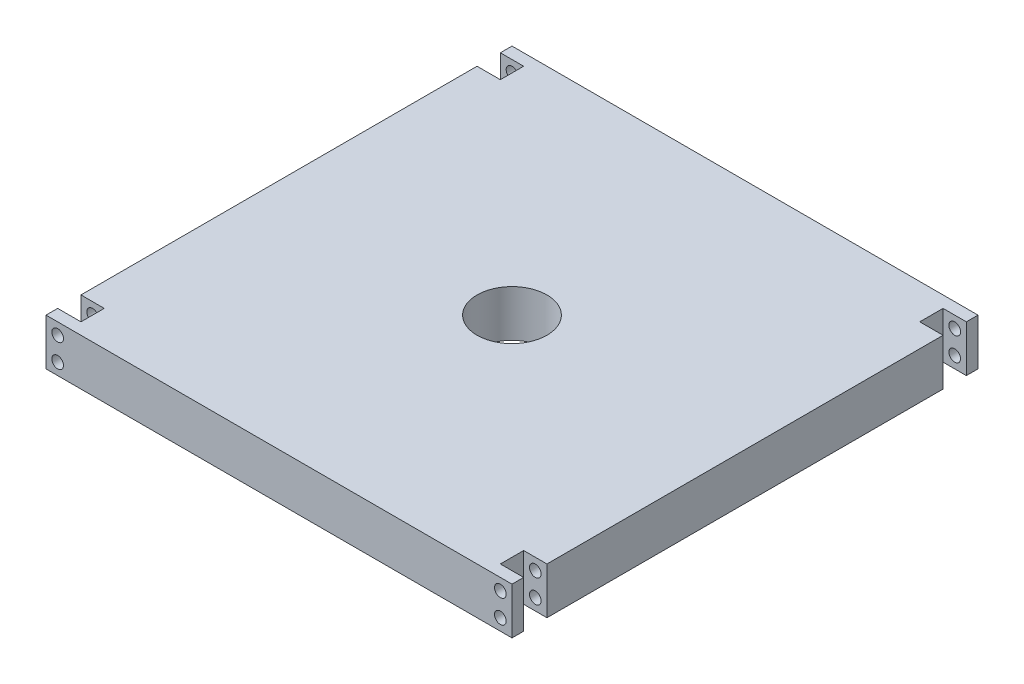
ISO-10303-21;
HEADER;
FILE_DESCRIPTION(('STEP AP214'),'2;1');
FILE_NAME('part.step','',(''),(''),'','','');
FILE_SCHEMA(('AUTOMOTIVE_DESIGN { 1 0 10303 214 1 1 1 1 }'));
ENDSEC;
DATA;
#1=APPLICATION_CONTEXT('core data for automotive mechanical design processes');
#2=APPLICATION_PROTOCOL_DEFINITION('international standard','automotive_design',2000,#1);
#3=PRODUCT_CONTEXT('',#1,'mechanical');
#4=PRODUCT('Part','Part','',(#3));
#5=PRODUCT_RELATED_PRODUCT_CATEGORY('part','',(#4));
#6=PRODUCT_DEFINITION_FORMATION('','',#4);
#7=PRODUCT_DEFINITION_CONTEXT('part definition',#1,'design');
#8=PRODUCT_DEFINITION('design','',#6,#7);
#9=PRODUCT_DEFINITION_SHAPE('','',#8);
#10=(LENGTH_UNIT() NAMED_UNIT(*) SI_UNIT(.MILLI.,.METRE.));
#11=(NAMED_UNIT(*) PLANE_ANGLE_UNIT() SI_UNIT($,.RADIAN.));
#12=(NAMED_UNIT(*) SI_UNIT($,.STERADIAN.) SOLID_ANGLE_UNIT());
#13=UNCERTAINTY_MEASURE_WITH_UNIT(LENGTH_MEASURE(1.E-05),#10,'distance_accuracy_value','');
#14=(GEOMETRIC_REPRESENTATION_CONTEXT(3) GLOBAL_UNCERTAINTY_ASSIGNED_CONTEXT((#13)) GLOBAL_UNIT_ASSIGNED_CONTEXT((#10,
#11,#12)) REPRESENTATION_CONTEXT('',''));
#15=CARTESIAN_POINT('',(0.,0.,0.));
#16=DIRECTION('',(0.,0.,1.));
#17=DIRECTION('',(1.,0.,0.));
#18=AXIS2_PLACEMENT_3D('',#15,#16,#17);
#19=CARTESIAN_POINT('',(0.,20.,0.));
#20=DIRECTION('',(0.,-1.,0.));
#21=DIRECTION('',(0.,0.,-1.));
#22=AXIS2_PLACEMENT_3D('',#19,#20,#21);
#23=PLANE('',#22);
#24=DIRECTION('',(0.,0.,1.));
#25=VECTOR('',#24,1.);
#26=CARTESIAN_POINT('',(-100.,20.,95.));
#27=LINE('',#26,#25);
#28=CARTESIAN_POINT('',(-100.,20.,95.));
#29=VERTEX_POINT('',#28);
#30=CARTESIAN_POINT('',(-100.,20.,100.));
#31=VERTEX_POINT('',#30);
#32=EDGE_CURVE('E243',#29,#31,#27,.T.);
#33=ORIENTED_EDGE('',*,*,#32,.T.);
#34=DIRECTION('',(1.,0.,0.));
#35=VECTOR('',#34,1.);
#36=CARTESIAN_POINT('',(100.,20.,100.));
#37=LINE('',#36,#35);
#38=CARTESIAN_POINT('',(100.,20.,100.));
#39=VERTEX_POINT('',#38);
#40=EDGE_CURVE('E131',#31,#39,#37,.T.);
#41=ORIENTED_EDGE('',*,*,#40,.T.);
#42=DIRECTION('',(0.,0.,-1.));
#43=VECTOR('',#42,1.);
#44=CARTESIAN_POINT('',(100.,20.,95.));
#45=LINE('',#44,#43);
#46=CARTESIAN_POINT('',(100.,20.,95.));
#47=VERTEX_POINT('',#46);
#48=EDGE_CURVE('E322',#39,#47,#45,.T.);
#49=ORIENTED_EDGE('',*,*,#48,.T.);
#50=DIRECTION('',(-1.,0.,0.));
#51=VECTOR('',#50,1.);
#52=CARTESIAN_POINT('',(100.,20.,95.));
#53=LINE('',#52,#51);
#54=CARTESIAN_POINT('',(90.,20.,95.));
#55=VERTEX_POINT('',#54);
#56=EDGE_CURVE('E324',#47,#55,#53,.T.);
#57=ORIENTED_EDGE('',*,*,#56,.T.);
#58=DIRECTION('',(0.,0.,-1.));
#59=VECTOR('',#58,1.);
#60=CARTESIAN_POINT('',(90.,20.,95.));
#61=LINE('',#60,#59);
#62=CARTESIAN_POINT('',(90.,20.,85.));
#63=VERTEX_POINT('',#62);
#64=EDGE_CURVE('E326',#55,#63,#61,.T.);
#65=ORIENTED_EDGE('',*,*,#64,.T.);
#66=DIRECTION('',(1.,0.,0.));
#67=VECTOR('',#66,1.);
#68=CARTESIAN_POINT('',(90.,20.,85.));
#69=LINE('',#68,#67);
#70=CARTESIAN_POINT('',(100.,20.,85.));
#71=VERTEX_POINT('',#70);
#72=EDGE_CURVE('E328',#63,#71,#69,.T.);
#73=ORIENTED_EDGE('',*,*,#72,.T.);
#74=DIRECTION('',(0.,0.,-1.));
#75=VECTOR('',#74,1.);
#76=CARTESIAN_POINT('',(100.,20.,-85.));
#77=LINE('',#76,#75);
#78=CARTESIAN_POINT('',(100.,20.,-85.));
#79=VERTEX_POINT('',#78);
#80=EDGE_CURVE('E330',#71,#79,#77,.T.);
#81=ORIENTED_EDGE('',*,*,#80,.T.);
#82=DIRECTION('',(-1.,0.,0.));
#83=VECTOR('',#82,1.);
#84=CARTESIAN_POINT('',(90.,20.,-85.));
#85=LINE('',#84,#83);
#86=CARTESIAN_POINT('',(90.,20.,-85.));
#87=VERTEX_POINT('',#86);
#88=EDGE_CURVE('E332',#79,#87,#85,.T.);
#89=ORIENTED_EDGE('',*,*,#88,.T.);
#90=DIRECTION('',(0.,0.,-1.));
#91=VECTOR('',#90,1.);
#92=CARTESIAN_POINT('',(90.,20.,-95.));
#93=LINE('',#92,#91);
#94=CARTESIAN_POINT('',(90.,20.,-95.));
#95=VERTEX_POINT('',#94);
#96=EDGE_CURVE('E334',#87,#95,#93,.T.);
#97=ORIENTED_EDGE('',*,*,#96,.T.);
#98=DIRECTION('',(1.,0.,0.));
#99=VECTOR('',#98,1.);
#100=CARTESIAN_POINT('',(100.,20.,-95.));
#101=LINE('',#100,#99);
#102=CARTESIAN_POINT('',(100.,20.,-95.));
#103=VERTEX_POINT('',#102);
#104=EDGE_CURVE('E336',#95,#103,#101,.T.);
#105=ORIENTED_EDGE('',*,*,#104,.T.);
#106=DIRECTION('',(0.,0.,-1.));
#107=VECTOR('',#106,1.);
#108=CARTESIAN_POINT('',(100.,20.,-100.));
#109=LINE('',#108,#107);
#110=CARTESIAN_POINT('',(100.,20.,-100.));
#111=VERTEX_POINT('',#110);
#112=EDGE_CURVE('E338',#103,#111,#109,.T.);
#113=ORIENTED_EDGE('',*,*,#112,.T.);
#114=DIRECTION('',(-1.,0.,0.));
#115=VECTOR('',#114,1.);
#116=CARTESIAN_POINT('',(100.,20.,-100.));
#117=LINE('',#116,#115);
#118=CARTESIAN_POINT('',(-100.,20.,-100.));
#119=VERTEX_POINT('',#118);
#120=EDGE_CURVE('E340',#111,#119,#117,.T.);
#121=ORIENTED_EDGE('',*,*,#120,.T.);
#122=DIRECTION('',(0.,0.,1.));
#123=VECTOR('',#122,1.);
#124=CARTESIAN_POINT('',(-100.,20.,-100.));
#125=LINE('',#124,#123);
#126=CARTESIAN_POINT('',(-100.,20.,-95.));
#127=VERTEX_POINT('',#126);
#128=EDGE_CURVE('E342',#119,#127,#125,.T.);
#129=ORIENTED_EDGE('',*,*,#128,.T.);
#130=DIRECTION('',(1.,0.,0.));
#131=VECTOR('',#130,1.);
#132=CARTESIAN_POINT('',(-100.,20.,-95.));
#133=LINE('',#132,#131);
#134=CARTESIAN_POINT('',(-90.,20.,-95.));
#135=VERTEX_POINT('',#134);
#136=EDGE_CURVE('E344',#127,#135,#133,.T.);
#137=ORIENTED_EDGE('',*,*,#136,.T.);
#138=DIRECTION('',(0.,0.,1.));
#139=VECTOR('',#138,1.);
#140=CARTESIAN_POINT('',(-90.,20.,-95.));
#141=LINE('',#140,#139);
#142=CARTESIAN_POINT('',(-90.,20.,-85.));
#143=VERTEX_POINT('',#142);
#144=EDGE_CURVE('E346',#135,#143,#141,.T.);
#145=ORIENTED_EDGE('',*,*,#144,.T.);
#146=DIRECTION('',(-1.,0.,0.));
#147=VECTOR('',#146,1.);
#148=CARTESIAN_POINT('',(-90.,20.,-85.));
#149=LINE('',#148,#147);
#150=CARTESIAN_POINT('',(-100.,20.,-85.));
#151=VERTEX_POINT('',#150);
#152=EDGE_CURVE('E348',#143,#151,#149,.T.);
#153=ORIENTED_EDGE('',*,*,#152,.T.);
#154=DIRECTION('',(0.,0.,1.));
#155=VECTOR('',#154,1.);
#156=CARTESIAN_POINT('',(-100.,20.,-85.));
#157=LINE('',#156,#155);
#158=CARTESIAN_POINT('',(-100.,20.,85.));
#159=VERTEX_POINT('',#158);
#160=EDGE_CURVE('E186',#151,#159,#157,.T.);
#161=ORIENTED_EDGE('',*,*,#160,.T.);
#162=DIRECTION('',(1.,0.,0.));
#163=VECTOR('',#162,1.);
#164=CARTESIAN_POINT('',(-90.,20.,85.));
#165=LINE('',#164,#163);
#166=CARTESIAN_POINT('',(-90.,20.,85.));
#167=VERTEX_POINT('',#166);
#168=EDGE_CURVE('E180',#159,#167,#165,.T.);
#169=ORIENTED_EDGE('',*,*,#168,.T.);
#170=DIRECTION('',(0.,0.,1.));
#171=VECTOR('',#170,1.);
#172=CARTESIAN_POINT('',(-90.,20.,95.));
#173=LINE('',#172,#171);
#174=CARTESIAN_POINT('',(-90.,20.,95.));
#175=VERTEX_POINT('',#174);
#176=EDGE_CURVE('E184',#167,#175,#173,.T.);
#177=ORIENTED_EDGE('',*,*,#176,.T.);
#178=DIRECTION('',(-1.,0.,0.));
#179=VECTOR('',#178,1.);
#180=CARTESIAN_POINT('',(-100.,20.,95.));
#181=LINE('',#180,#179);
#182=EDGE_CURVE('E52',#175,#29,#181,.T.);
#183=ORIENTED_EDGE('',*,*,#182,.T.);
#184=EDGE_LOOP('',(#33,#41,#49,#57,#65,#73,#81,#89,#97,#105,#113,#121,#129,#137,#145,#153,#161,
#169,#177,#183));
#185=FACE_BOUND('',#184,.T.);
#186=CARTESIAN_POINT('',(0.,20.,0.));
#187=DIRECTION('',(0.,1.,0.));
#188=DIRECTION('',(0.,0.,1.));
#189=AXIS2_PLACEMENT_3D('',#186,#187,#188);
#190=CIRCLE('',#189,15.);
#191=CARTESIAN_POINT('',(0.,20.,15.));
#192=VERTEX_POINT('',#191);
#193=EDGE_CURVE('E208',#192,#192,#190,.T.);
#194=ORIENTED_EDGE('',*,*,#193,.F.);
#195=EDGE_LOOP('',(#194));
#196=FACE_BOUND('',#195,.T.);
#197=ADVANCED_FACE('F33',(#185,#196),#23,.F.);
#198=CARTESIAN_POINT('',(0.,0.,0.));
#199=DIRECTION('',(0.,-1.,0.));
#200=DIRECTION('',(0.,0.,-1.));
#201=AXIS2_PLACEMENT_3D('',#198,#199,#200);
#202=PLANE('',#201);
#203=DIRECTION('',(0.,0.,1.));
#204=VECTOR('',#203,1.);
#205=CARTESIAN_POINT('',(-100.,0.,95.));
#206=LINE('',#205,#204);
#207=CARTESIAN_POINT('',(-100.,0.,95.));
#208=VERTEX_POINT('',#207);
#209=CARTESIAN_POINT('',(-100.,0.,100.));
#210=VERTEX_POINT('',#209);
#211=EDGE_CURVE('E204',#208,#210,#206,.T.);
#212=ORIENTED_EDGE('',*,*,#211,.F.);
#213=DIRECTION('',(-1.,0.,0.));
#214=VECTOR('',#213,1.);
#215=CARTESIAN_POINT('',(-100.,0.,95.));
#216=LINE('',#215,#214);
#217=CARTESIAN_POINT('',(-90.,0.,95.));
#218=VERTEX_POINT('',#217);
#219=EDGE_CURVE('E123',#218,#208,#216,.T.);
#220=ORIENTED_EDGE('',*,*,#219,.F.);
#221=DIRECTION('',(0.,0.,1.));
#222=VECTOR('',#221,1.);
#223=CARTESIAN_POINT('',(-90.,0.,95.));
#224=LINE('',#223,#222);
#225=CARTESIAN_POINT('',(-90.,0.,85.));
#226=VERTEX_POINT('',#225);
#227=EDGE_CURVE('E117',#226,#218,#224,.T.);
#228=ORIENTED_EDGE('',*,*,#227,.F.);
#229=DIRECTION('',(1.,0.,0.));
#230=VECTOR('',#229,1.);
#231=CARTESIAN_POINT('',(-90.,0.,85.));
#232=LINE('',#231,#230);
#233=CARTESIAN_POINT('',(-100.,0.,85.));
#234=VERTEX_POINT('',#233);
#235=EDGE_CURVE('E194',#234,#226,#232,.T.);
#236=ORIENTED_EDGE('',*,*,#235,.F.);
#237=DIRECTION('',(0.,0.,1.));
#238=VECTOR('',#237,1.);
#239=CARTESIAN_POINT('',(-100.,0.,-85.));
#240=LINE('',#239,#238);
#241=CARTESIAN_POINT('',(-100.,0.,-85.));
#242=VERTEX_POINT('',#241);
#243=EDGE_CURVE('E238',#242,#234,#240,.T.);
#244=ORIENTED_EDGE('',*,*,#243,.F.);
#245=DIRECTION('',(-1.,0.,0.));
#246=VECTOR('',#245,1.);
#247=CARTESIAN_POINT('',(-90.,0.,-85.));
#248=LINE('',#247,#246);
#249=CARTESIAN_POINT('',(-90.,0.,-85.));
#250=VERTEX_POINT('',#249);
#251=EDGE_CURVE('E236',#250,#242,#248,.T.);
#252=ORIENTED_EDGE('',*,*,#251,.F.);
#253=DIRECTION('',(0.,0.,1.));
#254=VECTOR('',#253,1.);
#255=CARTESIAN_POINT('',(-90.,0.,-95.));
#256=LINE('',#255,#254);
#257=CARTESIAN_POINT('',(-90.,0.,-95.));
#258=VERTEX_POINT('',#257);
#259=EDGE_CURVE('E234',#258,#250,#256,.T.);
#260=ORIENTED_EDGE('',*,*,#259,.F.);
#261=DIRECTION('',(1.,0.,0.));
#262=VECTOR('',#261,1.);
#263=CARTESIAN_POINT('',(-100.,0.,-95.));
#264=LINE('',#263,#262);
#265=CARTESIAN_POINT('',(-100.,0.,-95.));
#266=VERTEX_POINT('',#265);
#267=EDGE_CURVE('E232',#266,#258,#264,.T.);
#268=ORIENTED_EDGE('',*,*,#267,.F.);
#269=DIRECTION('',(0.,0.,1.));
#270=VECTOR('',#269,1.);
#271=CARTESIAN_POINT('',(-100.,0.,-100.));
#272=LINE('',#271,#270);
#273=CARTESIAN_POINT('',(-100.,0.,-100.));
#274=VERTEX_POINT('',#273);
#275=EDGE_CURVE('E230',#274,#266,#272,.T.);
#276=ORIENTED_EDGE('',*,*,#275,.F.);
#277=DIRECTION('',(-1.,0.,0.));
#278=VECTOR('',#277,1.);
#279=CARTESIAN_POINT('',(100.,0.,-100.));
#280=LINE('',#279,#278);
#281=CARTESIAN_POINT('',(100.,0.,-100.));
#282=VERTEX_POINT('',#281);
#283=EDGE_CURVE('E228',#282,#274,#280,.T.);
#284=ORIENTED_EDGE('',*,*,#283,.F.);
#285=DIRECTION('',(0.,0.,-1.));
#286=VECTOR('',#285,1.);
#287=CARTESIAN_POINT('',(100.,0.,-100.));
#288=LINE('',#287,#286);
#289=CARTESIAN_POINT('',(100.,0.,-95.));
#290=VERTEX_POINT('',#289);
#291=EDGE_CURVE('E226',#290,#282,#288,.T.);
#292=ORIENTED_EDGE('',*,*,#291,.F.);
#293=DIRECTION('',(1.,0.,0.));
#294=VECTOR('',#293,1.);
#295=CARTESIAN_POINT('',(100.,0.,-95.));
#296=LINE('',#295,#294);
#297=CARTESIAN_POINT('',(90.,0.,-95.));
#298=VERTEX_POINT('',#297);
#299=EDGE_CURVE('E224',#298,#290,#296,.T.);
#300=ORIENTED_EDGE('',*,*,#299,.F.);
#301=DIRECTION('',(0.,0.,-1.));
#302=VECTOR('',#301,1.);
#303=CARTESIAN_POINT('',(90.,0.,-95.));
#304=LINE('',#303,#302);
#305=CARTESIAN_POINT('',(90.,0.,-85.));
#306=VERTEX_POINT('',#305);
#307=EDGE_CURVE('E222',#306,#298,#304,.T.);
#308=ORIENTED_EDGE('',*,*,#307,.F.);
#309=DIRECTION('',(-1.,0.,0.));
#310=VECTOR('',#309,1.);
#311=CARTESIAN_POINT('',(90.,0.,-85.));
#312=LINE('',#311,#310);
#313=CARTESIAN_POINT('',(100.,0.,-85.));
#314=VERTEX_POINT('',#313);
#315=EDGE_CURVE('E220',#314,#306,#312,.T.);
#316=ORIENTED_EDGE('',*,*,#315,.F.);
#317=DIRECTION('',(0.,0.,-1.));
#318=VECTOR('',#317,1.);
#319=CARTESIAN_POINT('',(100.,0.,-85.));
#320=LINE('',#319,#318);
#321=CARTESIAN_POINT('',(100.,0.,85.));
#322=VERTEX_POINT('',#321);
#323=EDGE_CURVE('E218',#322,#314,#320,.T.);
#324=ORIENTED_EDGE('',*,*,#323,.F.);
#325=DIRECTION('',(1.,0.,0.));
#326=VECTOR('',#325,1.);
#327=CARTESIAN_POINT('',(90.,0.,85.));
#328=LINE('',#327,#326);
#329=CARTESIAN_POINT('',(90.,0.,85.));
#330=VERTEX_POINT('',#329);
#331=EDGE_CURVE('E216',#330,#322,#328,.T.);
#332=ORIENTED_EDGE('',*,*,#331,.F.);
#333=DIRECTION('',(0.,0.,-1.));
#334=VECTOR('',#333,1.);
#335=CARTESIAN_POINT('',(90.,0.,95.));
#336=LINE('',#335,#334);
#337=CARTESIAN_POINT('',(90.,0.,95.));
#338=VERTEX_POINT('',#337);
#339=EDGE_CURVE('E214',#338,#330,#336,.T.);
#340=ORIENTED_EDGE('',*,*,#339,.F.);
#341=DIRECTION('',(-1.,0.,0.));
#342=VECTOR('',#341,1.);
#343=CARTESIAN_POINT('',(100.,0.,95.));
#344=LINE('',#343,#342);
#345=CARTESIAN_POINT('',(100.,0.,95.));
#346=VERTEX_POINT('',#345);
#347=EDGE_CURVE('E212',#346,#338,#344,.T.);
#348=ORIENTED_EDGE('',*,*,#347,.F.);
#349=DIRECTION('',(0.,0.,-1.));
#350=VECTOR('',#349,1.);
#351=CARTESIAN_POINT('',(100.,0.,95.));
#352=LINE('',#351,#350);
#353=CARTESIAN_POINT('',(100.,0.,100.));
#354=VERTEX_POINT('',#353);
#355=EDGE_CURVE('E210',#354,#346,#352,.T.);
#356=ORIENTED_EDGE('',*,*,#355,.F.);
#357=DIRECTION('',(1.,0.,0.));
#358=VECTOR('',#357,1.);
#359=CARTESIAN_POINT('',(100.,0.,100.));
#360=LINE('',#359,#358);
#361=EDGE_CURVE('E207',#210,#354,#360,.T.);
#362=ORIENTED_EDGE('',*,*,#361,.F.);
#363=EDGE_LOOP('',(#212,#220,#228,#236,#244,#252,#260,#268,#276,#284,#292,#300,#308,#316,#324,
#332,#340,#348,#356,#362));
#364=FACE_BOUND('',#363,.T.);
#365=CARTESIAN_POINT('',(0.,0.,0.));
#366=DIRECTION('',(0.,1.,0.));
#367=DIRECTION('',(0.,0.,1.));
#368=AXIS2_PLACEMENT_3D('',#365,#366,#367);
#369=CIRCLE('',#368,15.);
#370=CARTESIAN_POINT('',(0.,0.,15.));
#371=VERTEX_POINT('',#370);
#372=EDGE_CURVE('E315',#371,#371,#369,.T.);
#373=ORIENTED_EDGE('',*,*,#372,.T.);
#374=EDGE_LOOP('',(#373));
#375=FACE_BOUND('',#374,.T.);
#376=ADVANCED_FACE('F361',(#364,#375),#202,.T.);
#377=CARTESIAN_POINT('',(-100.,20.,95.));
#378=DIRECTION('',(1.,0.,0.));
#379=DIRECTION('',(0.,0.,-1.));
#380=AXIS2_PLACEMENT_3D('',#377,#378,#379);
#381=PLANE('',#380);
#382=ORIENTED_EDGE('',*,*,#211,.T.);
#383=DIRECTION('',(0.,-1.,0.));
#384=VECTOR('',#383,1.);
#385=CARTESIAN_POINT('',(-100.,20.,100.));
#386=LINE('',#385,#384);
#387=EDGE_CURVE('E11',#31,#210,#386,.T.);
#388=ORIENTED_EDGE('',*,*,#387,.F.);
#389=ORIENTED_EDGE('',*,*,#32,.F.);
#390=DIRECTION('',(0.,-1.,0.));
#391=VECTOR('',#390,1.);
#392=CARTESIAN_POINT('',(-100.,20.,95.));
#393=LINE('',#392,#391);
#394=EDGE_CURVE('E200',#29,#208,#393,.T.);
#395=ORIENTED_EDGE('',*,*,#394,.T.);
#396=EDGE_LOOP('',(#382,#388,#389,#395));
#397=FACE_BOUND('',#396,.T.);
#398=ADVANCED_FACE('F35',(#397),#381,.F.);
#399=CARTESIAN_POINT('',(100.,20.,100.));
#400=DIRECTION('',(0.,0.,-1.));
#401=DIRECTION('',(-1.,0.,0.));
#402=AXIS2_PLACEMENT_3D('',#399,#400,#401);
#403=PLANE('',#402);
#404=CARTESIAN_POINT('',(95.,15.,100.));
#405=DIRECTION('',(0.,0.,1.));
#406=DIRECTION('',(-1.,0.,0.));
#407=AXIS2_PLACEMENT_3D('',#404,#405,#406);
#408=CIRCLE('',#407,2.5);
#409=CARTESIAN_POINT('',(92.5,15.,100.));
#410=VERTEX_POINT('',#409);
#411=EDGE_CURVE('E433',#410,#410,#408,.T.);
#412=ORIENTED_EDGE('',*,*,#411,.F.);
#413=EDGE_LOOP('',(#412));
#414=FACE_BOUND('',#413,.T.);
#415=CARTESIAN_POINT('',(95.,5.,100.));
#416=DIRECTION('',(0.,0.,1.));
#417=DIRECTION('',(-1.,0.,0.));
#418=AXIS2_PLACEMENT_3D('',#415,#416,#417);
#419=CIRCLE('',#418,2.49999999999999);
#420=CARTESIAN_POINT('',(92.5,5.,100.));
#421=VERTEX_POINT('',#420);
#422=EDGE_CURVE('E442',#421,#421,#419,.T.);
#423=ORIENTED_EDGE('',*,*,#422,.F.);
#424=EDGE_LOOP('',(#423));
#425=FACE_BOUND('',#424,.T.);
#426=CARTESIAN_POINT('',(-95.,5.,100.));
#427=DIRECTION('',(0.,0.,1.));
#428=DIRECTION('',(1.,0.,0.));
#429=AXIS2_PLACEMENT_3D('',#426,#427,#428);
#430=CIRCLE('',#429,2.49999999999999);
#431=CARTESIAN_POINT('',(-92.5,5.,100.));
#432=VERTEX_POINT('',#431);
#433=EDGE_CURVE('E460',#432,#432,#430,.T.);
#434=ORIENTED_EDGE('',*,*,#433,.F.);
#435=EDGE_LOOP('',(#434));
#436=FACE_BOUND('',#435,.T.);
#437=CARTESIAN_POINT('',(-95.,15.,100.));
#438=DIRECTION('',(0.,0.,1.));
#439=DIRECTION('',(1.,0.,0.));
#440=AXIS2_PLACEMENT_3D('',#437,#438,#439);
#441=CIRCLE('',#440,2.5);
#442=CARTESIAN_POINT('',(-92.5,15.,100.));
#443=VERTEX_POINT('',#442);
#444=EDGE_CURVE('E300',#443,#443,#441,.T.);
#445=ORIENTED_EDGE('',*,*,#444,.F.);
#446=EDGE_LOOP('',(#445));
#447=FACE_BOUND('',#446,.T.);
#448=ORIENTED_EDGE('',*,*,#361,.T.);
#449=DIRECTION('',(0.,-1.,0.));
#450=VECTOR('',#449,1.);
#451=CARTESIAN_POINT('',(100.,20.,100.));
#452=LINE('',#451,#450);
#453=EDGE_CURVE('E43',#39,#354,#452,.T.);
#454=ORIENTED_EDGE('',*,*,#453,.F.);
#455=ORIENTED_EDGE('',*,*,#40,.F.);
#456=ORIENTED_EDGE('',*,*,#387,.T.);
#457=EDGE_LOOP('',(#448,#454,#455,#456));
#458=FACE_BOUND('',#457,.T.);
#459=ADVANCED_FACE('F539',(#414,#425,#436,#447,#458),#403,.F.);
#460=CARTESIAN_POINT('',(100.,20.,95.));
#461=DIRECTION('',(-1.,0.,0.));
#462=DIRECTION('',(0.,0.,1.));
#463=AXIS2_PLACEMENT_3D('',#460,#461,#462);
#464=PLANE('',#463);
#465=ORIENTED_EDGE('',*,*,#355,.T.);
#466=DIRECTION('',(0.,-1.,0.));
#467=VECTOR('',#466,1.);
#468=CARTESIAN_POINT('',(100.,20.,95.));
#469=LINE('',#468,#467);
#470=EDGE_CURVE('E286',#47,#346,#469,.T.);
#471=ORIENTED_EDGE('',*,*,#470,.F.);
#472=ORIENTED_EDGE('',*,*,#48,.F.);
#473=ORIENTED_EDGE('',*,*,#453,.T.);
#474=EDGE_LOOP('',(#465,#471,#472,#473));
#475=FACE_BOUND('',#474,.T.);
#476=ADVANCED_FACE('F536',(#475),#464,.F.);
#477=CARTESIAN_POINT('',(100.,20.,95.));
#478=DIRECTION('',(0.,0.,1.));
#479=DIRECTION('',(1.,0.,0.));
#480=AXIS2_PLACEMENT_3D('',#477,#478,#479);
#481=PLANE('',#480);
#482=CARTESIAN_POINT('',(95.,15.,95.));
#483=DIRECTION('',(0.,0.,1.));
#484=DIRECTION('',(1.,0.,0.));
#485=AXIS2_PLACEMENT_3D('',#482,#483,#484);
#486=CIRCLE('',#485,2.5);
#487=CARTESIAN_POINT('',(97.5,15.,95.));
#488=VERTEX_POINT('',#487);
#489=EDGE_CURVE('E439',#488,#488,#486,.T.);
#490=ORIENTED_EDGE('',*,*,#489,.T.);
#491=EDGE_LOOP('',(#490));
#492=FACE_BOUND('',#491,.T.);
#493=CARTESIAN_POINT('',(95.,5.,95.));
#494=DIRECTION('',(0.,0.,1.));
#495=DIRECTION('',(1.,0.,0.));
#496=AXIS2_PLACEMENT_3D('',#493,#494,#495);
#497=CIRCLE('',#496,2.49999999999999);
#498=CARTESIAN_POINT('',(97.5,5.,95.));
#499=VERTEX_POINT('',#498);
#500=EDGE_CURVE('E457',#499,#499,#497,.T.);
#501=ORIENTED_EDGE('',*,*,#500,.T.);
#502=EDGE_LOOP('',(#501));
#503=FACE_BOUND('',#502,.T.);
#504=ORIENTED_EDGE('',*,*,#347,.T.);
#505=DIRECTION('',(0.,-1.,0.));
#506=VECTOR('',#505,1.);
#507=CARTESIAN_POINT('',(90.,20.,95.));
#508=LINE('',#507,#506);
#509=EDGE_CURVE('E283',#55,#338,#508,.T.);
#510=ORIENTED_EDGE('',*,*,#509,.F.);
#511=ORIENTED_EDGE('',*,*,#56,.F.);
#512=ORIENTED_EDGE('',*,*,#470,.T.);
#513=EDGE_LOOP('',(#504,#510,#511,#512));
#514=FACE_BOUND('',#513,.T.);
#515=ADVANCED_FACE('F532',(#492,#503,#514),#481,.F.);
#516=CARTESIAN_POINT('',(90.,20.,95.));
#517=DIRECTION('',(-1.,0.,0.));
#518=DIRECTION('',(0.,0.,1.));
#519=AXIS2_PLACEMENT_3D('',#516,#517,#518);
#520=PLANE('',#519);
#521=ORIENTED_EDGE('',*,*,#339,.T.);
#522=DIRECTION('',(0.,-1.,0.));
#523=VECTOR('',#522,1.);
#524=CARTESIAN_POINT('',(90.,20.,85.));
#525=LINE('',#524,#523);
#526=EDGE_CURVE('E280',#63,#330,#525,.T.);
#527=ORIENTED_EDGE('',*,*,#526,.F.);
#528=ORIENTED_EDGE('',*,*,#64,.F.);
#529=ORIENTED_EDGE('',*,*,#509,.T.);
#530=EDGE_LOOP('',(#521,#527,#528,#529));
#531=FACE_BOUND('',#530,.T.);
#532=ADVANCED_FACE('F528',(#531),#520,.F.);
#533=CARTESIAN_POINT('',(90.,20.,85.));
#534=DIRECTION('',(0.,0.,-1.));
#535=DIRECTION('',(-1.,0.,0.));
#536=AXIS2_PLACEMENT_3D('',#533,#534,#535);
#537=PLANE('',#536);
#538=CARTESIAN_POINT('',(95.,15.,85.));
#539=DIRECTION('',(0.,0.,-1.));
#540=DIRECTION('',(-1.,0.,0.));
#541=AXIS2_PLACEMENT_3D('',#538,#539,#540);
#542=CIRCLE('',#541,2.5);
#543=CARTESIAN_POINT('',(92.5,15.,85.));
#544=VERTEX_POINT('',#543);
#545=EDGE_CURVE('E431',#544,#544,#542,.T.);
#546=ORIENTED_EDGE('',*,*,#545,.T.);
#547=EDGE_LOOP('',(#546));
#548=FACE_BOUND('',#547,.T.);
#549=CARTESIAN_POINT('',(95.,5.,85.));
#550=DIRECTION('',(0.,0.,-1.));
#551=DIRECTION('',(-1.,0.,0.));
#552=AXIS2_PLACEMENT_3D('',#549,#550,#551);
#553=CIRCLE('',#552,2.49999999999999);
#554=CARTESIAN_POINT('',(92.5,5.,85.));
#555=VERTEX_POINT('',#554);
#556=EDGE_CURVE('E454',#555,#555,#553,.T.);
#557=ORIENTED_EDGE('',*,*,#556,.T.);
#558=EDGE_LOOP('',(#557));
#559=FACE_BOUND('',#558,.T.);
#560=ORIENTED_EDGE('',*,*,#331,.T.);
#561=DIRECTION('',(0.,-1.,0.));
#562=VECTOR('',#561,1.);
#563=CARTESIAN_POINT('',(100.,20.,85.));
#564=LINE('',#563,#562);
#565=EDGE_CURVE('E277',#71,#322,#564,.T.);
#566=ORIENTED_EDGE('',*,*,#565,.F.);
#567=ORIENTED_EDGE('',*,*,#72,.F.);
#568=ORIENTED_EDGE('',*,*,#526,.T.);
#569=EDGE_LOOP('',(#560,#566,#567,#568));
#570=FACE_BOUND('',#569,.T.);
#571=ADVANCED_FACE('F524',(#548,#559,#570),#537,.F.);
#572=CARTESIAN_POINT('',(100.,20.,-85.));
#573=DIRECTION('',(-1.,0.,0.));
#574=DIRECTION('',(0.,0.,1.));
#575=AXIS2_PLACEMENT_3D('',#572,#573,#574);
#576=PLANE('',#575);
#577=ORIENTED_EDGE('',*,*,#323,.T.);
#578=DIRECTION('',(0.,-1.,0.));
#579=VECTOR('',#578,1.);
#580=CARTESIAN_POINT('',(100.,20.,-85.));
#581=LINE('',#580,#579);
#582=EDGE_CURVE('E274',#79,#314,#581,.T.);
#583=ORIENTED_EDGE('',*,*,#582,.F.);
#584=ORIENTED_EDGE('',*,*,#80,.F.);
#585=ORIENTED_EDGE('',*,*,#565,.T.);
#586=EDGE_LOOP('',(#577,#583,#584,#585));
#587=FACE_BOUND('',#586,.T.);
#588=ADVANCED_FACE('F520',(#587),#576,.F.);
#589=CARTESIAN_POINT('',(90.,20.,-85.));
#590=DIRECTION('',(0.,0.,1.));
#591=DIRECTION('',(1.,0.,0.));
#592=AXIS2_PLACEMENT_3D('',#589,#590,#591);
#593=PLANE('',#592);
#594=CARTESIAN_POINT('',(95.,15.,-85.));
#595=DIRECTION('',(0.,0.,1.));
#596=DIRECTION('',(1.,0.,0.));
#597=AXIS2_PLACEMENT_3D('',#594,#595,#596);
#598=CIRCLE('',#597,2.5);
#599=CARTESIAN_POINT('',(97.5,15.,-85.));
#600=VERTEX_POINT('',#599);
#601=EDGE_CURVE('E428',#600,#600,#598,.T.);
#602=ORIENTED_EDGE('',*,*,#601,.T.);
#603=EDGE_LOOP('',(#602));
#604=FACE_BOUND('',#603,.T.);
#605=CARTESIAN_POINT('',(95.,5.,-85.));
#606=DIRECTION('',(0.,0.,1.));
#607=DIRECTION('',(1.,0.,0.));
#608=AXIS2_PLACEMENT_3D('',#605,#606,#607);
#609=CIRCLE('',#608,2.49999999999999);
#610=CARTESIAN_POINT('',(97.5,5.,-85.));
#611=VERTEX_POINT('',#610);
#612=EDGE_CURVE('E451',#611,#611,#609,.T.);
#613=ORIENTED_EDGE('',*,*,#612,.T.);
#614=EDGE_LOOP('',(#613));
#615=FACE_BOUND('',#614,.T.);
#616=ORIENTED_EDGE('',*,*,#315,.T.);
#617=DIRECTION('',(0.,-1.,0.));
#618=VECTOR('',#617,1.);
#619=CARTESIAN_POINT('',(90.,20.,-85.));
#620=LINE('',#619,#618);
#621=EDGE_CURVE('E271',#87,#306,#620,.T.);
#622=ORIENTED_EDGE('',*,*,#621,.F.);
#623=ORIENTED_EDGE('',*,*,#88,.F.);
#624=ORIENTED_EDGE('',*,*,#582,.T.);
#625=EDGE_LOOP('',(#616,#622,#623,#624));
#626=FACE_BOUND('',#625,.T.);
#627=ADVANCED_FACE('F516',(#604,#615,#626),#593,.F.);
#628=CARTESIAN_POINT('',(90.,20.,-95.));
#629=DIRECTION('',(-1.,0.,0.));
#630=DIRECTION('',(0.,0.,1.));
#631=AXIS2_PLACEMENT_3D('',#628,#629,#630);
#632=PLANE('',#631);
#633=ORIENTED_EDGE('',*,*,#307,.T.);
#634=DIRECTION('',(0.,-1.,0.));
#635=VECTOR('',#634,1.);
#636=CARTESIAN_POINT('',(90.,20.,-95.));
#637=LINE('',#636,#635);
#638=EDGE_CURVE('E268',#95,#298,#637,.T.);
#639=ORIENTED_EDGE('',*,*,#638,.F.);
#640=ORIENTED_EDGE('',*,*,#96,.F.);
#641=ORIENTED_EDGE('',*,*,#621,.T.);
#642=EDGE_LOOP('',(#633,#639,#640,#641));
#643=FACE_BOUND('',#642,.T.);
#644=ADVANCED_FACE('F513',(#643),#632,.F.);
#645=CARTESIAN_POINT('',(100.,20.,-95.));
#646=DIRECTION('',(0.,0.,-1.));
#647=DIRECTION('',(-1.,0.,0.));
#648=AXIS2_PLACEMENT_3D('',#645,#646,#647);
#649=PLANE('',#648);
#650=CARTESIAN_POINT('',(95.,15.,-95.));
#651=DIRECTION('',(0.,0.,-1.));
#652=DIRECTION('',(-1.,0.,0.));
#653=AXIS2_PLACEMENT_3D('',#650,#651,#652);
#654=CIRCLE('',#653,2.5);
#655=CARTESIAN_POINT('',(92.5,15.,-95.));
#656=VERTEX_POINT('',#655);
#657=EDGE_CURVE('E426',#656,#656,#654,.T.);
#658=ORIENTED_EDGE('',*,*,#657,.T.);
#659=EDGE_LOOP('',(#658));
#660=FACE_BOUND('',#659,.T.);
#661=CARTESIAN_POINT('',(95.,5.,-95.));
#662=DIRECTION('',(0.,0.,-1.));
#663=DIRECTION('',(-1.,0.,0.));
#664=AXIS2_PLACEMENT_3D('',#661,#662,#663);
#665=CIRCLE('',#664,2.49999999999999);
#666=CARTESIAN_POINT('',(92.5,5.,-95.));
#667=VERTEX_POINT('',#666);
#668=EDGE_CURVE('E446',#667,#667,#665,.T.);
#669=ORIENTED_EDGE('',*,*,#668,.T.);
#670=EDGE_LOOP('',(#669));
#671=FACE_BOUND('',#670,.T.);
#672=ORIENTED_EDGE('',*,*,#299,.T.);
#673=DIRECTION('',(0.,-1.,0.));
#674=VECTOR('',#673,1.);
#675=CARTESIAN_POINT('',(100.,20.,-95.));
#676=LINE('',#675,#674);
#677=EDGE_CURVE('E265',#103,#290,#676,.T.);
#678=ORIENTED_EDGE('',*,*,#677,.F.);
#679=ORIENTED_EDGE('',*,*,#104,.F.);
#680=ORIENTED_EDGE('',*,*,#638,.T.);
#681=EDGE_LOOP('',(#672,#678,#679,#680));
#682=FACE_BOUND('',#681,.T.);
#683=ADVANCED_FACE('F509',(#660,#671,#682),#649,.F.);
#684=CARTESIAN_POINT('',(100.,20.,-100.));
#685=DIRECTION('',(-1.,0.,0.));
#686=DIRECTION('',(0.,0.,1.));
#687=AXIS2_PLACEMENT_3D('',#684,#685,#686);
#688=PLANE('',#687);
#689=ORIENTED_EDGE('',*,*,#291,.T.);
#690=DIRECTION('',(0.,-1.,0.));
#691=VECTOR('',#690,1.);
#692=CARTESIAN_POINT('',(100.,20.,-100.));
#693=LINE('',#692,#691);
#694=EDGE_CURVE('E262',#111,#282,#693,.T.);
#695=ORIENTED_EDGE('',*,*,#694,.F.);
#696=ORIENTED_EDGE('',*,*,#112,.F.);
#697=ORIENTED_EDGE('',*,*,#677,.T.);
#698=EDGE_LOOP('',(#689,#695,#696,#697));
#699=FACE_BOUND('',#698,.T.);
#700=ADVANCED_FACE('F505',(#699),#688,.F.);
#701=CARTESIAN_POINT('',(100.,20.,-100.));
#702=DIRECTION('',(0.,0.,1.));
#703=DIRECTION('',(1.,0.,0.));
#704=AXIS2_PLACEMENT_3D('',#701,#702,#703);
#705=PLANE('',#704);
#706=CARTESIAN_POINT('',(95.,15.,-100.));
#707=DIRECTION('',(0.,0.,1.));
#708=DIRECTION('',(-1.,0.,0.));
#709=AXIS2_PLACEMENT_3D('',#706,#707,#708);
#710=CIRCLE('',#709,2.5);
#711=CARTESIAN_POINT('',(92.5,15.,-100.));
#712=VERTEX_POINT('',#711);
#713=EDGE_CURVE('E423',#712,#712,#710,.T.);
#714=ORIENTED_EDGE('',*,*,#713,.T.);
#715=EDGE_LOOP('',(#714));
#716=FACE_BOUND('',#715,.T.);
#717=CARTESIAN_POINT('',(95.,5.,-100.));
#718=DIRECTION('',(0.,0.,1.));
#719=DIRECTION('',(-1.,0.,0.));
#720=AXIS2_PLACEMENT_3D('',#717,#718,#719);
#721=CIRCLE('',#720,2.49999999999999);
#722=CARTESIAN_POINT('',(92.5,5.,-100.));
#723=VERTEX_POINT('',#722);
#724=EDGE_CURVE('E443',#723,#723,#721,.T.);
#725=ORIENTED_EDGE('',*,*,#724,.T.);
#726=EDGE_LOOP('',(#725));
#727=FACE_BOUND('',#726,.T.);
#728=CARTESIAN_POINT('',(-95.,5.,-100.));
#729=DIRECTION('',(0.,0.,1.));
#730=DIRECTION('',(1.,0.,0.));
#731=AXIS2_PLACEMENT_3D('',#728,#729,#730);
#732=CIRCLE('',#731,2.49999999999999);
#733=CARTESIAN_POINT('',(-92.5,5.,-100.));
#734=VERTEX_POINT('',#733);
#735=EDGE_CURVE('E461',#734,#734,#732,.T.);
#736=ORIENTED_EDGE('',*,*,#735,.T.);
#737=EDGE_LOOP('',(#736));
#738=FACE_BOUND('',#737,.T.);
#739=CARTESIAN_POINT('',(-95.,15.,-100.));
#740=DIRECTION('',(0.,0.,1.));
#741=DIRECTION('',(1.,0.,0.));
#742=AXIS2_PLACEMENT_3D('',#739,#740,#741);
#743=CIRCLE('',#742,2.5);
#744=CARTESIAN_POINT('',(-92.5,15.,-100.));
#745=VERTEX_POINT('',#744);
#746=EDGE_CURVE('E293',#745,#745,#743,.T.);
#747=ORIENTED_EDGE('',*,*,#746,.T.);
#748=EDGE_LOOP('',(#747));
#749=FACE_BOUND('',#748,.T.);
#750=ORIENTED_EDGE('',*,*,#283,.T.);
#751=DIRECTION('',(0.,-1.,0.));
#752=VECTOR('',#751,1.);
#753=CARTESIAN_POINT('',(-100.,20.,-100.));
#754=LINE('',#753,#752);
#755=EDGE_CURVE('E259',#119,#274,#754,.T.);
#756=ORIENTED_EDGE('',*,*,#755,.F.);
#757=ORIENTED_EDGE('',*,*,#120,.F.);
#758=ORIENTED_EDGE('',*,*,#694,.T.);
#759=EDGE_LOOP('',(#750,#756,#757,#758));
#760=FACE_BOUND('',#759,.T.);
#761=ADVANCED_FACE('F501',(#716,#727,#738,#749,#760),#705,.F.);
#762=CARTESIAN_POINT('',(-100.,20.,-100.));
#763=DIRECTION('',(1.,0.,0.));
#764=DIRECTION('',(0.,0.,-1.));
#765=AXIS2_PLACEMENT_3D('',#762,#763,#764);
#766=PLANE('',#765);
#767=ORIENTED_EDGE('',*,*,#275,.T.);
#768=DIRECTION('',(0.,-1.,0.));
#769=VECTOR('',#768,1.);
#770=CARTESIAN_POINT('',(-100.,20.,-95.));
#771=LINE('',#770,#769);
#772=EDGE_CURVE('E256',#127,#266,#771,.T.);
#773=ORIENTED_EDGE('',*,*,#772,.F.);
#774=ORIENTED_EDGE('',*,*,#128,.F.);
#775=ORIENTED_EDGE('',*,*,#755,.T.);
#776=EDGE_LOOP('',(#767,#773,#774,#775));
#777=FACE_BOUND('',#776,.T.);
#778=ADVANCED_FACE('F480',(#777),#766,.F.);
#779=CARTESIAN_POINT('',(-100.,20.,-95.));
#780=DIRECTION('',(0.,0.,-1.));
#781=DIRECTION('',(-1.,0.,0.));
#782=AXIS2_PLACEMENT_3D('',#779,#780,#781);
#783=PLANE('',#782);
#784=CARTESIAN_POINT('',(-95.,5.,-95.));
#785=DIRECTION('',(0.,0.,-1.));
#786=DIRECTION('',(-1.,0.,0.));
#787=AXIS2_PLACEMENT_3D('',#784,#785,#786);
#788=CIRCLE('',#787,2.49999999999999);
#789=CARTESIAN_POINT('',(-97.5,5.,-95.));
#790=VERTEX_POINT('',#789);
#791=EDGE_CURVE('E305',#790,#790,#788,.T.);
#792=ORIENTED_EDGE('',*,*,#791,.T.);
#793=EDGE_LOOP('',(#792));
#794=FACE_BOUND('',#793,.T.);
#795=CARTESIAN_POINT('',(-95.,15.,-95.));
#796=DIRECTION('',(0.,0.,-1.));
#797=DIRECTION('',(-1.,0.,0.));
#798=AXIS2_PLACEMENT_3D('',#795,#796,#797);
#799=CIRCLE('',#798,2.5);
#800=CARTESIAN_POINT('',(-97.5,15.,-95.));
#801=VERTEX_POINT('',#800);
#802=EDGE_CURVE('E312',#801,#801,#799,.T.);
#803=ORIENTED_EDGE('',*,*,#802,.T.);
#804=EDGE_LOOP('',(#803));
#805=FACE_BOUND('',#804,.T.);
#806=ORIENTED_EDGE('',*,*,#267,.T.);
#807=DIRECTION('',(0.,-1.,0.));
#808=VECTOR('',#807,1.);
#809=CARTESIAN_POINT('',(-90.,20.,-95.));
#810=LINE('',#809,#808);
#811=EDGE_CURVE('E253',#135,#258,#810,.T.);
#812=ORIENTED_EDGE('',*,*,#811,.F.);
#813=ORIENTED_EDGE('',*,*,#136,.F.);
#814=ORIENTED_EDGE('',*,*,#772,.T.);
#815=EDGE_LOOP('',(#806,#812,#813,#814));
#816=FACE_BOUND('',#815,.T.);
#817=ADVANCED_FACE('F475',(#794,#805,#816),#783,.F.);
#818=CARTESIAN_POINT('',(-90.,20.,-95.));
#819=DIRECTION('',(1.,0.,0.));
#820=DIRECTION('',(0.,0.,-1.));
#821=AXIS2_PLACEMENT_3D('',#818,#819,#820);
#822=PLANE('',#821);
#823=ORIENTED_EDGE('',*,*,#259,.T.);
#824=DIRECTION('',(0.,-1.,0.));
#825=VECTOR('',#824,1.);
#826=CARTESIAN_POINT('',(-90.,20.,-85.));
#827=LINE('',#826,#825);
#828=EDGE_CURVE('E250',#143,#250,#827,.T.);
#829=ORIENTED_EDGE('',*,*,#828,.F.);
#830=ORIENTED_EDGE('',*,*,#144,.F.);
#831=ORIENTED_EDGE('',*,*,#811,.T.);
#832=EDGE_LOOP('',(#823,#829,#830,#831));
#833=FACE_BOUND('',#832,.T.);
#834=ADVANCED_FACE('F479',(#833),#822,.F.);
#835=CARTESIAN_POINT('',(-90.,20.,-85.));
#836=DIRECTION('',(0.,0.,1.));
#837=DIRECTION('',(1.,0.,0.));
#838=AXIS2_PLACEMENT_3D('',#835,#836,#837);
#839=PLANE('',#838);
#840=CARTESIAN_POINT('',(-95.,5.,-85.));
#841=DIRECTION('',(0.,0.,1.));
#842=DIRECTION('',(1.,0.,0.));
#843=AXIS2_PLACEMENT_3D('',#840,#841,#842);
#844=CIRCLE('',#843,2.49999999999999);
#845=CARTESIAN_POINT('',(-92.5,5.,-85.));
#846=VERTEX_POINT('',#845);
#847=EDGE_CURVE('E468',#846,#846,#844,.T.);
#848=ORIENTED_EDGE('',*,*,#847,.T.);
#849=EDGE_LOOP('',(#848));
#850=FACE_BOUND('',#849,.T.);
#851=CARTESIAN_POINT('',(-95.,15.,-85.));
#852=DIRECTION('',(0.,0.,1.));
#853=DIRECTION('',(1.,0.,0.));
#854=AXIS2_PLACEMENT_3D('',#851,#852,#853);
#855=CIRCLE('',#854,2.5);
#856=CARTESIAN_POINT('',(-92.5,15.,-85.));
#857=VERTEX_POINT('',#856);
#858=EDGE_CURVE('E297',#857,#857,#855,.T.);
#859=ORIENTED_EDGE('',*,*,#858,.T.);
#860=EDGE_LOOP('',(#859));
#861=FACE_BOUND('',#860,.T.);
#862=ORIENTED_EDGE('',*,*,#251,.T.);
#863=DIRECTION('',(0.,-1.,0.));
#864=VECTOR('',#863,1.);
#865=CARTESIAN_POINT('',(-100.,20.,-85.));
#866=LINE('',#865,#864);
#867=EDGE_CURVE('E247',#151,#242,#866,.T.);
#868=ORIENTED_EDGE('',*,*,#867,.F.);
#869=ORIENTED_EDGE('',*,*,#152,.F.);
#870=ORIENTED_EDGE('',*,*,#828,.T.);
#871=EDGE_LOOP('',(#862,#868,#869,#870));
#872=FACE_BOUND('',#871,.T.);
#873=ADVANCED_FACE('F354',(#850,#861,#872),#839,.F.);
#874=CARTESIAN_POINT('',(-100.,20.,-85.));
#875=DIRECTION('',(1.,0.,0.));
#876=DIRECTION('',(0.,0.,-1.));
#877=AXIS2_PLACEMENT_3D('',#874,#875,#876);
#878=PLANE('',#877);
#879=ORIENTED_EDGE('',*,*,#243,.T.);
#880=DIRECTION('',(0.,-1.,0.));
#881=VECTOR('',#880,1.);
#882=CARTESIAN_POINT('',(-100.,20.,85.));
#883=LINE('',#882,#881);
#884=EDGE_CURVE('E195',#159,#234,#883,.T.);
#885=ORIENTED_EDGE('',*,*,#884,.F.);
#886=ORIENTED_EDGE('',*,*,#160,.F.);
#887=ORIENTED_EDGE('',*,*,#867,.T.);
#888=EDGE_LOOP('',(#879,#885,#886,#887));
#889=FACE_BOUND('',#888,.T.);
#890=ADVANCED_FACE('F358',(#889),#878,.F.);
#891=CARTESIAN_POINT('',(-90.,20.,85.));
#892=DIRECTION('',(0.,0.,-1.));
#893=DIRECTION('',(-1.,0.,0.));
#894=AXIS2_PLACEMENT_3D('',#891,#892,#893);
#895=PLANE('',#894);
#896=CARTESIAN_POINT('',(-95.,5.,85.));
#897=DIRECTION('',(0.,0.,-1.));
#898=DIRECTION('',(-1.,0.,0.));
#899=AXIS2_PLACEMENT_3D('',#896,#897,#898);
#900=CIRCLE('',#899,2.49999999999999);
#901=CARTESIAN_POINT('',(-97.5,5.,85.));
#902=VERTEX_POINT('',#901);
#903=EDGE_CURVE('E466',#902,#902,#900,.T.);
#904=ORIENTED_EDGE('',*,*,#903,.T.);
#905=EDGE_LOOP('',(#904));
#906=FACE_BOUND('',#905,.T.);
#907=CARTESIAN_POINT('',(-95.,15.,85.));
#908=DIRECTION('',(0.,0.,-1.));
#909=DIRECTION('',(-1.,0.,0.));
#910=AXIS2_PLACEMENT_3D('',#907,#908,#909);
#911=CIRCLE('',#910,2.5);
#912=CARTESIAN_POINT('',(-97.5,15.,85.));
#913=VERTEX_POINT('',#912);
#914=EDGE_CURVE('E292',#913,#913,#911,.T.);
#915=ORIENTED_EDGE('',*,*,#914,.T.);
#916=EDGE_LOOP('',(#915));
#917=FACE_BOUND('',#916,.T.);
#918=ORIENTED_EDGE('',*,*,#235,.T.);
#919=DIRECTION('',(0.,-1.,0.));
#920=VECTOR('',#919,1.);
#921=CARTESIAN_POINT('',(-90.,20.,85.));
#922=LINE('',#921,#920);
#923=EDGE_CURVE('E191',#167,#226,#922,.T.);
#924=ORIENTED_EDGE('',*,*,#923,.F.);
#925=ORIENTED_EDGE('',*,*,#168,.F.);
#926=ORIENTED_EDGE('',*,*,#884,.T.);
#927=EDGE_LOOP('',(#918,#924,#925,#926));
#928=FACE_BOUND('',#927,.T.);
#929=ADVANCED_FACE('F192',(#906,#917,#928),#895,.F.);
#930=CARTESIAN_POINT('',(-90.,20.,95.));
#931=DIRECTION('',(1.,0.,0.));
#932=DIRECTION('',(0.,0.,-1.));
#933=AXIS2_PLACEMENT_3D('',#930,#931,#932);
#934=PLANE('',#933);
#935=ORIENTED_EDGE('',*,*,#227,.T.);
#936=DIRECTION('',(0.,-1.,0.));
#937=VECTOR('',#936,1.);
#938=CARTESIAN_POINT('',(-90.,20.,95.));
#939=LINE('',#938,#937);
#940=EDGE_CURVE('E196',#175,#218,#939,.T.);
#941=ORIENTED_EDGE('',*,*,#940,.F.);
#942=ORIENTED_EDGE('',*,*,#176,.F.);
#943=ORIENTED_EDGE('',*,*,#923,.T.);
#944=EDGE_LOOP('',(#935,#941,#942,#943));
#945=FACE_BOUND('',#944,.T.);
#946=ADVANCED_FACE('F198',(#945),#934,.F.);
#947=CARTESIAN_POINT('',(-100.,20.,95.));
#948=DIRECTION('',(0.,0.,1.));
#949=DIRECTION('',(1.,0.,0.));
#950=AXIS2_PLACEMENT_3D('',#947,#948,#949);
#951=PLANE('',#950);
#952=CARTESIAN_POINT('',(-95.,5.,95.));
#953=DIRECTION('',(0.,0.,1.));
#954=DIRECTION('',(1.,0.,0.));
#955=AXIS2_PLACEMENT_3D('',#952,#953,#954);
#956=CIRCLE('',#955,2.49999999999999);
#957=CARTESIAN_POINT('',(-92.5,5.,95.));
#958=VERTEX_POINT('',#957);
#959=EDGE_CURVE('E37',#958,#958,#956,.T.);
#960=ORIENTED_EDGE('',*,*,#959,.T.);
#961=EDGE_LOOP('',(#960));
#962=FACE_BOUND('',#961,.T.);
#963=CARTESIAN_POINT('',(-95.,15.,95.));
#964=DIRECTION('',(0.,0.,1.));
#965=DIRECTION('',(1.,0.,0.));
#966=AXIS2_PLACEMENT_3D('',#963,#964,#965);
#967=CIRCLE('',#966,2.5);
#968=CARTESIAN_POINT('',(-92.5,15.,95.));
#969=VERTEX_POINT('',#968);
#970=EDGE_CURVE('E290',#969,#969,#967,.T.);
#971=ORIENTED_EDGE('',*,*,#970,.T.);
#972=EDGE_LOOP('',(#971));
#973=FACE_BOUND('',#972,.T.);
#974=ORIENTED_EDGE('',*,*,#219,.T.);
#975=ORIENTED_EDGE('',*,*,#394,.F.);
#976=ORIENTED_EDGE('',*,*,#182,.F.);
#977=ORIENTED_EDGE('',*,*,#940,.T.);
#978=EDGE_LOOP('',(#974,#975,#976,#977));
#979=FACE_BOUND('',#978,.T.);
#980=ADVANCED_FACE('F367',(#962,#973,#979),#951,.F.);
#981=CARTESIAN_POINT('',(0.,20.,0.));
#982=DIRECTION('',(0.,-1.,0.));
#983=DIRECTION('',(0.,0.,-1.));
#984=AXIS2_PLACEMENT_3D('',#981,#982,#983);
#985=CYLINDRICAL_SURFACE('',#984,15.);
#986=ORIENTED_EDGE('',*,*,#193,.T.);
#987=EDGE_LOOP('',(#986));
#988=FACE_BOUND('',#987,.T.);
#989=ORIENTED_EDGE('',*,*,#372,.F.);
#990=EDGE_LOOP('',(#989));
#991=FACE_BOUND('',#990,.T.);
#992=ADVANCED_FACE('F369',(#988,#991),#985,.F.);
#993=CARTESIAN_POINT('',(-95.,15.,-100.));
#994=DIRECTION('',(0.,0.,1.));
#995=DIRECTION('',(1.,0.,0.));
#996=AXIS2_PLACEMENT_3D('',#993,#994,#995);
#997=CYLINDRICAL_SURFACE('',#996,2.5);
#998=ORIENTED_EDGE('',*,*,#444,.T.);
#999=EDGE_LOOP('',(#998));
#1000=FACE_BOUND('',#999,.T.);
#1001=ORIENTED_EDGE('',*,*,#970,.F.);
#1002=EDGE_LOOP('',(#1001));
#1003=FACE_BOUND('',#1002,.T.);
#1004=ADVANCED_FACE('F376',(#1000,#1003),#997,.F.);
#1005=ORIENTED_EDGE('',*,*,#914,.F.);
#1006=EDGE_LOOP('',(#1005));
#1007=FACE_BOUND('',#1006,.T.);
#1008=ORIENTED_EDGE('',*,*,#858,.F.);
#1009=EDGE_LOOP('',(#1008));
#1010=FACE_BOUND('',#1009,.T.);
#1011=ADVANCED_FACE('F392',(#1007,#1010),#997,.F.);
#1012=ORIENTED_EDGE('',*,*,#746,.F.);
#1013=EDGE_LOOP('',(#1012));
#1014=FACE_BOUND('',#1013,.T.);
#1015=ORIENTED_EDGE('',*,*,#802,.F.);
#1016=EDGE_LOOP('',(#1015));
#1017=FACE_BOUND('',#1016,.T.);
#1018=ADVANCED_FACE('F388',(#1014,#1017),#997,.F.);
#1019=CARTESIAN_POINT('',(-95.,5.,-100.));
#1020=DIRECTION('',(0.,0.,1.));
#1021=DIRECTION('',(1.,0.,0.));
#1022=AXIS2_PLACEMENT_3D('',#1019,#1020,#1021);
#1023=CYLINDRICAL_SURFACE('',#1022,2.49999999999999);
#1024=ORIENTED_EDGE('',*,*,#433,.T.);
#1025=EDGE_LOOP('',(#1024));
#1026=FACE_BOUND('',#1025,.T.);
#1027=ORIENTED_EDGE('',*,*,#959,.F.);
#1028=EDGE_LOOP('',(#1027));
#1029=FACE_BOUND('',#1028,.T.);
#1030=ADVANCED_FACE('F391',(#1026,#1029),#1023,.F.);
#1031=ORIENTED_EDGE('',*,*,#903,.F.);
#1032=EDGE_LOOP('',(#1031));
#1033=FACE_BOUND('',#1032,.T.);
#1034=ORIENTED_EDGE('',*,*,#847,.F.);
#1035=EDGE_LOOP('',(#1034));
#1036=FACE_BOUND('',#1035,.T.);
#1037=ADVANCED_FACE('F398',(#1033,#1036),#1023,.F.);
#1038=ORIENTED_EDGE('',*,*,#735,.F.);
#1039=EDGE_LOOP('',(#1038));
#1040=FACE_BOUND('',#1039,.T.);
#1041=ORIENTED_EDGE('',*,*,#791,.F.);
#1042=EDGE_LOOP('',(#1041));
#1043=FACE_BOUND('',#1042,.T.);
#1044=ADVANCED_FACE('F394',(#1040,#1043),#1023,.F.);
#1045=CARTESIAN_POINT('',(95.,5.,-100.));
#1046=DIRECTION('',(0.,0.,1.));
#1047=DIRECTION('',(1.,0.,0.));
#1048=AXIS2_PLACEMENT_3D('',#1045,#1046,#1047);
#1049=CYLINDRICAL_SURFACE('',#1048,2.49999999999999);
#1050=ORIENTED_EDGE('',*,*,#724,.F.);
#1051=EDGE_LOOP('',(#1050));
#1052=FACE_BOUND('',#1051,.T.);
#1053=ORIENTED_EDGE('',*,*,#668,.F.);
#1054=EDGE_LOOP('',(#1053));
#1055=FACE_BOUND('',#1054,.T.);
#1056=ADVANCED_FACE('F397',(#1052,#1055),#1049,.F.);
#1057=ORIENTED_EDGE('',*,*,#612,.F.);
#1058=EDGE_LOOP('',(#1057));
#1059=FACE_BOUND('',#1058,.T.);
#1060=ORIENTED_EDGE('',*,*,#556,.F.);
#1061=EDGE_LOOP('',(#1060));
#1062=FACE_BOUND('',#1061,.T.);
#1063=ADVANCED_FACE('F404',(#1059,#1062),#1049,.F.);
#1064=ORIENTED_EDGE('',*,*,#422,.T.);
#1065=EDGE_LOOP('',(#1064));
#1066=FACE_BOUND('',#1065,.T.);
#1067=ORIENTED_EDGE('',*,*,#500,.F.);
#1068=EDGE_LOOP('',(#1067));
#1069=FACE_BOUND('',#1068,.T.);
#1070=ADVANCED_FACE('F400',(#1066,#1069),#1049,.F.);
#1071=CARTESIAN_POINT('',(95.,15.,-100.));
#1072=DIRECTION('',(0.,0.,1.));
#1073=DIRECTION('',(1.,0.,0.));
#1074=AXIS2_PLACEMENT_3D('',#1071,#1072,#1073);
#1075=CYLINDRICAL_SURFACE('',#1074,2.5);
#1076=ORIENTED_EDGE('',*,*,#713,.F.);
#1077=EDGE_LOOP('',(#1076));
#1078=FACE_BOUND('',#1077,.T.);
#1079=ORIENTED_EDGE('',*,*,#657,.F.);
#1080=EDGE_LOOP('',(#1079));
#1081=FACE_BOUND('',#1080,.T.);
#1082=ADVANCED_FACE('F403',(#1078,#1081),#1075,.F.);
#1083=ORIENTED_EDGE('',*,*,#601,.F.);
#1084=EDGE_LOOP('',(#1083));
#1085=FACE_BOUND('',#1084,.T.);
#1086=ORIENTED_EDGE('',*,*,#545,.F.);
#1087=EDGE_LOOP('',(#1086));
#1088=FACE_BOUND('',#1087,.T.);
#1089=ADVANCED_FACE('F408',(#1085,#1088),#1075,.F.);
#1090=ORIENTED_EDGE('',*,*,#411,.T.);
#1091=EDGE_LOOP('',(#1090));
#1092=FACE_BOUND('',#1091,.T.);
#1093=ORIENTED_EDGE('',*,*,#489,.F.);
#1094=EDGE_LOOP('',(#1093));
#1095=FACE_BOUND('',#1094,.T.);
#1096=ADVANCED_FACE('F406',(#1092,#1095),#1075,.F.);
#1097=CLOSED_SHELL('',(#197,#376,#398,#459,#476,#515,#532,#571,#588,#627,#644,#683,#700,#761,
#778,#817,#834,#873,#890,#929,#946,#980,#992,#1004,#1011,#1018,#1030,#1037,#1044,#1056,#1063,
#1070,#1082,#1089,#1096));
#1098=MANIFOLD_SOLID_BREP('B2',#1097);
#1099=ADVANCED_BREP_SHAPE_REPRESENTATION('',(#18,#1098),#14);
#1100=SHAPE_DEFINITION_REPRESENTATION(#9,#1099);
ENDSEC;
END-ISO-10303-21;
